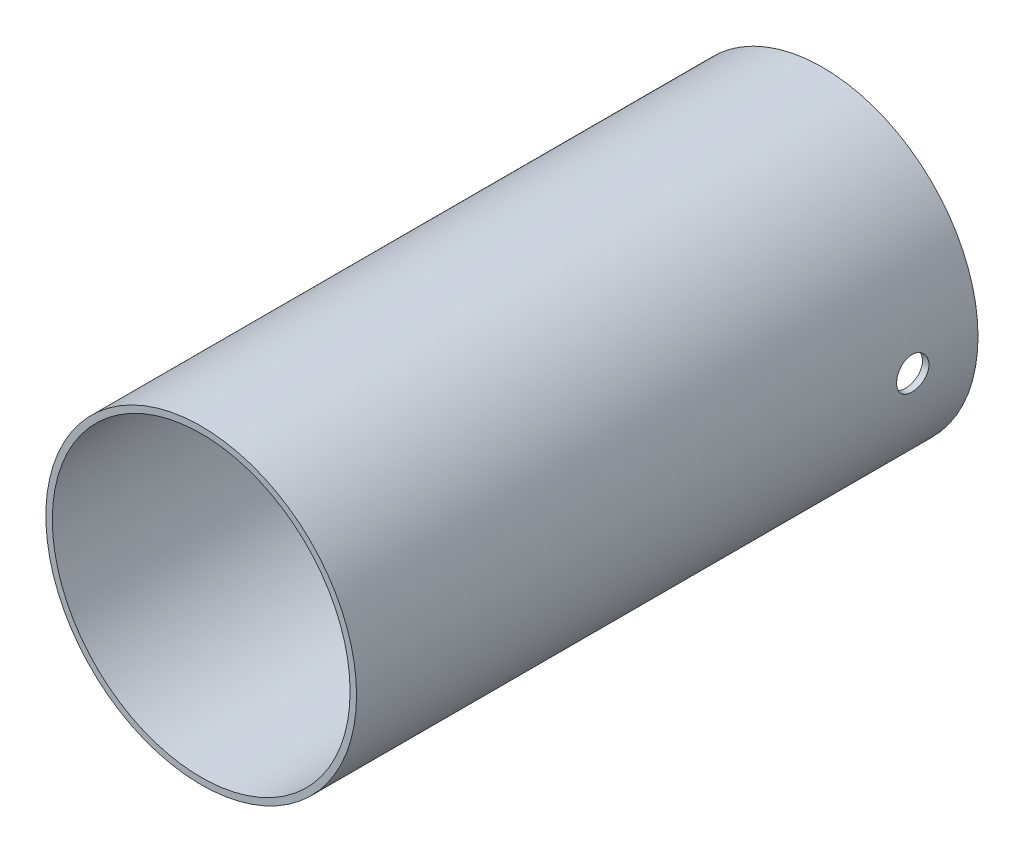
ISO-10303-21;
HEADER;
FILE_DESCRIPTION(('STEP AP214'),'2;1');
FILE_NAME('part.step','',(''),(''),'','','');
FILE_SCHEMA(('AUTOMOTIVE_DESIGN { 1 0 10303 214 1 1 1 1 }'));
ENDSEC;
DATA;
#1=APPLICATION_CONTEXT('core data for automotive mechanical design processes');
#2=APPLICATION_PROTOCOL_DEFINITION('international standard','automotive_design',2000,#1);
#3=PRODUCT_CONTEXT('',#1,'mechanical');
#4=PRODUCT('Part','Part','',(#3));
#5=PRODUCT_RELATED_PRODUCT_CATEGORY('part','',(#4));
#6=PRODUCT_DEFINITION_FORMATION('','',#4);
#7=PRODUCT_DEFINITION_CONTEXT('part definition',#1,'design');
#8=PRODUCT_DEFINITION('design','',#6,#7);
#9=PRODUCT_DEFINITION_SHAPE('','',#8);
#10=(LENGTH_UNIT() NAMED_UNIT(*) SI_UNIT(.MILLI.,.METRE.));
#11=(NAMED_UNIT(*) PLANE_ANGLE_UNIT() SI_UNIT($,.RADIAN.));
#12=(NAMED_UNIT(*) SI_UNIT($,.STERADIAN.) SOLID_ANGLE_UNIT());
#13=UNCERTAINTY_MEASURE_WITH_UNIT(LENGTH_MEASURE(1.E-05),#10,'distance_accuracy_value','');
#14=(GEOMETRIC_REPRESENTATION_CONTEXT(3) GLOBAL_UNCERTAINTY_ASSIGNED_CONTEXT((#13)) GLOBAL_UNIT_ASSIGNED_CONTEXT((#10,
#11,#12)) REPRESENTATION_CONTEXT('',''));
#15=CARTESIAN_POINT('',(0.,0.,0.));
#16=DIRECTION('',(0.,0.,1.));
#17=DIRECTION('',(1.,0.,0.));
#18=AXIS2_PLACEMENT_3D('',#15,#16,#17);
#19=CARTESIAN_POINT('',(0.,0.,152.4));
#20=DIRECTION('',(0.,0.,1.));
#21=DIRECTION('',(1.,0.,0.));
#22=AXIS2_PLACEMENT_3D('',#19,#20,#21);
#23=PLANE('',#22);
#24=CARTESIAN_POINT('',(0.,0.,152.4));
#25=DIRECTION('',(0.,0.,1.));
#26=DIRECTION('',(1.,0.,0.));
#27=AXIS2_PLACEMENT_3D('',#24,#25,#26);
#28=CIRCLE('',#27,38.1);
#29=CARTESIAN_POINT('',(38.1,0.,152.4));
#30=VERTEX_POINT('',#29);
#31=EDGE_CURVE('E10',#30,#30,#28,.T.);
#32=ORIENTED_EDGE('',*,*,#31,.T.);
#33=EDGE_LOOP('',(#32));
#34=FACE_BOUND('',#33,.T.);
#35=CARTESIAN_POINT('',(0.,0.,152.4));
#36=DIRECTION('',(0.,0.,1.));
#37=DIRECTION('',(1.,0.,0.));
#38=AXIS2_PLACEMENT_3D('',#35,#36,#37);
#39=CIRCLE('',#38,36.5125);
#40=CARTESIAN_POINT('',(36.5125,0.,152.4));
#41=VERTEX_POINT('',#40);
#42=EDGE_CURVE('E62',#41,#41,#39,.T.);
#43=ORIENTED_EDGE('',*,*,#42,.F.);
#44=EDGE_LOOP('',(#43));
#45=FACE_BOUND('',#44,.T.);
#46=ADVANCED_FACE('F43',(#34,#45),#23,.T.);
#47=CARTESIAN_POINT('',(0.,0.,0.));
#48=DIRECTION('',(0.,0.,1.));
#49=DIRECTION('',(1.,0.,0.));
#50=AXIS2_PLACEMENT_3D('',#47,#48,#49);
#51=PLANE('',#50);
#52=CARTESIAN_POINT('',(0.,0.,0.));
#53=DIRECTION('',(0.,0.,1.));
#54=DIRECTION('',(1.,0.,0.));
#55=AXIS2_PLACEMENT_3D('',#52,#53,#54);
#56=CIRCLE('',#55,38.1);
#57=CARTESIAN_POINT('',(38.1,0.,0.));
#58=VERTEX_POINT('',#57);
#59=EDGE_CURVE('E60',#58,#58,#56,.T.);
#60=ORIENTED_EDGE('',*,*,#59,.F.);
#61=EDGE_LOOP('',(#60));
#62=FACE_BOUND('',#61,.T.);
#63=CARTESIAN_POINT('',(0.,0.,0.));
#64=DIRECTION('',(0.,0.,1.));
#65=DIRECTION('',(1.,0.,0.));
#66=AXIS2_PLACEMENT_3D('',#63,#64,#65);
#67=CIRCLE('',#66,36.5125);
#68=CARTESIAN_POINT('',(36.5125,0.,0.));
#69=VERTEX_POINT('',#68);
#70=EDGE_CURVE('E65',#69,#69,#67,.T.);
#71=ORIENTED_EDGE('',*,*,#70,.T.);
#72=EDGE_LOOP('',(#71));
#73=FACE_BOUND('',#72,.T.);
#74=ADVANCED_FACE('F101',(#62,#73),#51,.F.);
#75=CARTESIAN_POINT('',(0.,0.,152.4));
#76=DIRECTION('',(0.,0.,-1.));
#77=DIRECTION('',(-1.,0.,0.));
#78=AXIS2_PLACEMENT_3D('',#75,#76,#77);
#79=CYLINDRICAL_SURFACE('',#78,38.1);
#80=CARTESIAN_POINT('',(-38.1,0.,19.9657647635163));
#81=CARTESIAN_POINT('',(-38.0999973380005,-0.222240286314071,19.9681301815195));
#82=CARTESIAN_POINT('',(-38.0980348164911,-0.444826119671895,19.9517851275532));
#83=CARTESIAN_POINT('',(-38.0903739183317,-0.884224198578029,19.8820706361082));
#84=CARTESIAN_POINT('',(-38.0846714682688,-1.10102988031823,19.8286608251671));
#85=CARTESIAN_POINT('',(-38.0701539071397,-1.52243577563149,19.6863898306075));
#86=CARTESIAN_POINT('',(-38.061340695723,-1.72704334928982,19.597550278587));
#87=CARTESIAN_POINT('',(-38.0415672665706,-2.11839546348186,19.3869870970999));
#88=CARTESIAN_POINT('',(-38.0306074657095,-2.30514346193822,19.2652698508485));
#89=CARTESIAN_POINT('',(-38.007703089001,-2.65624028697904,18.991905252133));
#90=CARTESIAN_POINT('',(-37.9957552682925,-2.82051019083909,18.8401567985776));
#91=CARTESIAN_POINT('',(-37.9722305156241,-3.12130232645465,18.5112441400305));
#92=CARTESIAN_POINT('',(-37.960653601519,-3.25782322411344,18.3340787137581));
#93=CARTESIAN_POINT('',(-37.9391338582952,-3.49956265491322,17.9588198449494));
#94=CARTESIAN_POINT('',(-37.9291951668749,-3.60470245451846,17.7606754250677));
#95=CARTESIAN_POINT('',(-37.9121084495107,-3.78019198118367,17.3494242630021));
#96=CARTESIAN_POINT('',(-37.9049603518898,-3.85054260182365,17.1363179052846));
#97=CARTESIAN_POINT('',(-37.8942860186173,-3.95421553052005,16.7019820706622));
#98=CARTESIAN_POINT('',(-37.8907471823665,-3.98766669500737,16.4807836665807));
#99=CARTESIAN_POINT('',(-37.8876494621099,-4.01699457768456,16.0358854458264));
#100=CARTESIAN_POINT('',(-37.888090461606,-4.0128723957251,15.8121857025645));
#101=CARTESIAN_POINT('',(-37.8928919590414,-3.96727193251874,15.3695936000412));
#102=CARTESIAN_POINT('',(-37.8972365405565,-3.92594534677651,15.1506854132345));
#103=CARTESIAN_POINT('',(-37.9093337386499,-3.80735295205664,14.7229312695853));
#104=CARTESIAN_POINT('',(-37.9170864004554,-3.73008666613593,14.5140854463174));
#105=CARTESIAN_POINT('',(-37.9351485611281,-3.54167042537473,14.1119623256837));
#106=CARTESIAN_POINT('',(-37.9454624893978,-3.43046169402249,13.9187127754795));
#107=CARTESIAN_POINT('',(-37.9674925918325,-3.17735571225536,13.5535684037795));
#108=CARTESIAN_POINT('',(-37.9792088108406,-3.03545748032039,13.3816742655552));
#109=CARTESIAN_POINT('',(-38.0028056567546,-2.7241846474097,13.0632501809492));
#110=CARTESIAN_POINT('',(-38.0146868039183,-2.55468090318136,12.9168464874082));
#111=CARTESIAN_POINT('',(-38.0372385448196,-2.19343985900176,12.6545505263645));
#112=CARTESIAN_POINT('',(-38.0479091352636,-2.00170249856308,12.5386583418724));
#113=CARTESIAN_POINT('',(-38.0668618378565,-1.60130175853183,12.3406546980226));
#114=CARTESIAN_POINT('',(-38.0751429821874,-1.392631564209,12.2585569209766));
#115=CARTESIAN_POINT('',(-38.088395419989,-0.964361874354098,12.13060136007));
#116=CARTESIAN_POINT('',(-38.0933668196799,-0.744762729809806,12.0847424131818));
#117=CARTESIAN_POINT('',(-38.0994438290943,-0.301949542599554,12.0307392475563));
#118=CARTESIAN_POINT('',(-38.1005671145875,-0.0787567727203302,12.0224225277416));
#119=CARTESIAN_POINT('',(-38.09889204431,0.365852386752666,12.0432781524268));
#120=CARTESIAN_POINT('',(-38.096093750969,0.587268804568697,12.0724499001272));
#121=CARTESIAN_POINT('',(-38.0869220713211,1.02148859161998,12.1673073993738));
#122=CARTESIAN_POINT('',(-38.0805573924802,1.23431159040156,12.2329042142271));
#123=CARTESIAN_POINT('',(-38.0649886621349,1.64593424221331,12.3986541166961));
#124=CARTESIAN_POINT('',(-38.0557845444878,1.8447335684398,12.4988080093));
#125=CARTESIAN_POINT('',(-38.0355424590914,2.22343009907675,12.7312344626035));
#126=CARTESIAN_POINT('',(-38.0244981988321,2.40325886231441,12.8636179771196));
#127=CARTESIAN_POINT('',(-38.0018481097387,2.73820659016409,13.1565956440352));
#128=CARTESIAN_POINT('',(-37.99024226516,2.89332486146299,13.3171905877095));
#129=CARTESIAN_POINT('',(-37.9677356696638,3.17508422481082,13.6628101230627));
#130=CARTESIAN_POINT('',(-37.95683795018,3.30160798182817,13.8479305990597));
#131=CARTESIAN_POINT('',(-37.9370452792416,3.52177009745061,14.2368897422551));
#132=CARTESIAN_POINT('',(-37.9281503011811,3.61540889293101,14.440728160741));
#133=CARTESIAN_POINT('',(-37.9133988897085,3.76696309764424,14.8609930660663));
#134=CARTESIAN_POINT('',(-37.9075373001905,3.82493915769373,15.0773974921879));
#135=CARTESIAN_POINT('',(-37.899506573112,3.90371527137365,15.5169350965197));
#136=CARTESIAN_POINT('',(-37.8973373186853,3.92451650162751,15.7400680615372));
#137=CARTESIAN_POINT('',(-37.8969431222345,3.92832072208022,16.1855785181006));
#138=CARTESIAN_POINT('',(-37.8986992014745,3.91150558468665,16.4079544608685));
#139=CARTESIAN_POINT('',(-37.9059147493473,3.84094588855145,16.8467038996259));
#140=CARTESIAN_POINT('',(-37.9113742164697,3.78720134486996,17.0630773980632));
#141=CARTESIAN_POINT('',(-37.9253693568586,3.64437481518619,17.4836259297361));
#142=CARTESIAN_POINT('',(-37.9339038737421,3.55530611168854,17.6878055149316));
#143=CARTESIAN_POINT('',(-37.9530799658502,3.34438111362365,18.0783453010408));
#144=CARTESIAN_POINT('',(-37.9637215343167,3.22252492421954,18.264705559106));
#145=CARTESIAN_POINT('',(-37.9859618408592,2.94882785356972,18.6152385768411));
#146=CARTESIAN_POINT('',(-37.9975647169562,2.79685295708304,18.7793064362522));
#147=CARTESIAN_POINT('',(-38.0203719713399,2.46748951150007,19.0796934274808));
#148=CARTESIAN_POINT('',(-38.031576253276,2.29009486920403,19.2160058872138));
#149=CARTESIAN_POINT('',(-38.0523415715049,1.91436093031876,19.4573347989211));
#150=CARTESIAN_POINT('',(-38.0618977662411,1.71596259699027,19.5622596857727));
#151=CARTESIAN_POINT('',(-38.078219614406,1.30438931487588,19.7371689258021));
#152=CARTESIAN_POINT('',(-38.0849883917652,1.09123122255266,19.8071924125017));
#153=CARTESIAN_POINT('',(-38.0932619855573,0.730741349430766,19.8927382891227));
#154=CARTESIAN_POINT('',(-38.0957753500471,0.58582585548763,19.9187095843001));
#155=CARTESIAN_POINT('',(-38.0991452343958,0.293990677338522,19.9544401091937));
#156=CARTESIAN_POINT('',(-38.10000176162,0.147071002044943,19.9641994109794));
#157=CARTESIAN_POINT('',(-38.1,0.,19.9657647635163));
#158=B_SPLINE_CURVE_WITH_KNOTS('',3,(#80,#81,#82,#83,#84,#85,#86,#87,#88,#89,#90,#91,#92,#93,
#94,#95,#96,#97,#98,#99,#100,#101,#102,#103,#104,#105,#106,#107,#108,#109,#110,#111,#112,#113,
#114,#115,#116,#117,#118,#119,#120,#121,#122,#123,#124,#125,#126,#127,#128,#129,#130,#131,#132,
#133,#134,#135,#136,#137,#138,#139,#140,#141,#142,#143,#144,#145,#146,#147,#148,#149,#150,#151,
#152,#153,#154,#155,#156,#157),.UNSPECIFIED.,.T.,.F.,(4,2,2,2,2,2,2,2,2,2,2,2,2,2,2,2,2,2,2,2,2,
2,2,2,2,2,2,2,2,2,2,2,2,2,2,2,2,2,4),(0.,0.66622162994521,1.33317009535484,1.99971197783714,
2.6661245438917,3.33481999205229,4.00354758167027,4.6739391363386,5.34431347072074,
6.01233930903843,6.68034559290123,7.34564045385931,8.0109441439625,8.67740650868059,
9.34389019153536,10.0135864224992,10.6832844754403,11.3532534023813,12.0232008268593,
12.6900667859489,13.3569221289653,14.0221563693538,14.6874061070552,15.3549792506588,
16.0225711213576,16.6928545716466,17.3631291169119,18.0322605666568,18.701370837295,
19.367253003875,20.0331348989026,20.6987666476724,21.3643962615094,22.0330569709471,
22.7018782295895,23.3726319890328,24.0426319580571,24.4835165514881,24.9243991849886),.UNSPECIFIED.);
#159=CARTESIAN_POINT('',(-38.1,0.,19.9657647635163));
#160=VERTEX_POINT('',#159);
#161=EDGE_CURVE('E89',#160,#160,#158,.T.);
#162=ORIENTED_EDGE('',*,*,#161,.T.);
#163=EDGE_LOOP('',(#162));
#164=FACE_BOUND('',#163,.T.);
#165=CARTESIAN_POINT('',(37.8971247592395,-3.92656783751875,15.9972413707971));
#166=CARTESIAN_POINT('',(37.8971274557515,-3.92655823071737,16.2195180016725));
#167=CARTESIAN_POINT('',(37.8990807778637,-3.90782926532647,16.4419403874323));
#168=CARTESIAN_POINT('',(37.9066799294298,-3.83340083515749,16.8806148964558));
#169=CARTESIAN_POINT('',(37.9123297961887,-3.77766094667101,17.0968600031776));
#170=CARTESIAN_POINT('',(37.9266700087259,-3.6308550065597,17.5167639738677));
#171=CARTESIAN_POINT('',(37.9353584776029,-3.53981075816766,17.7204305162731));
#172=CARTESIAN_POINT('',(37.954786099503,-3.32502398812938,18.1095504227851));
#173=CARTESIAN_POINT('',(37.9655248537506,-3.20128782318803,18.2950073180196));
#174=CARTESIAN_POINT('',(37.9878787831124,-2.92410814897545,18.6432159425045));
#175=CARTESIAN_POINT('',(37.9994968942879,-2.77056217479886,18.8058859276921));
#176=CARTESIAN_POINT('',(38.0222586653219,-2.4383419009891,19.1031988710632));
#177=CARTESIAN_POINT('',(38.033402303174,-2.25966643748756,19.2378405304023));
#178=CARTESIAN_POINT('',(38.0539725461321,-1.88175704679417,19.4755592889126));
#179=CARTESIAN_POINT('',(38.0633951801345,-1.68247719367238,19.5785637511829));
#180=CARTESIAN_POINT('',(38.0794101472821,-1.26933528067318,19.7496194269149));
#181=CARTESIAN_POINT('',(38.0860025548489,-1.05547360440007,19.8176715594667));
#182=CARTESIAN_POINT('',(38.0955737183549,-0.620067305100164,19.9166502804125));
#183=CARTESIAN_POINT('',(38.0985655727999,-0.398553564939551,19.9477114345117));
#184=CARTESIAN_POINT('',(38.1006214368524,0.0465605694395146,19.9722429586582));
#185=CARTESIAN_POINT('',(38.0996855562951,0.270160905133927,19.9657143798631));
#186=CARTESIAN_POINT('',(38.0939821109215,0.712187307715731,19.9153607843175));
#187=CARTESIAN_POINT('',(38.0892294161831,0.930630074789205,19.8716804695403));
#188=CARTESIAN_POINT('',(38.0764220182467,1.35706343083521,19.7484888695129));
#189=CARTESIAN_POINT('',(38.0683672690476,1.56505387415059,19.6689770850911));
#190=CARTESIAN_POINT('',(38.0498156656909,1.9651340857752,19.4762216609764));
#191=CARTESIAN_POINT('',(38.0393141995361,2.15719288451326,19.3629142028886));
#192=CARTESIAN_POINT('',(38.0170294632349,2.51962106034087,19.1058301651));
#193=CARTESIAN_POINT('',(38.0052461522825,2.68998974657702,18.9620526152824));
#194=CARTESIAN_POINT('',(37.9816377006684,3.00505050094374,18.6472964065389));
#195=CARTESIAN_POINT('',(37.9698126270473,3.14961681149344,18.4761918339352));
#196=CARTESIAN_POINT('',(37.9474957628723,3.40799608306273,18.1120745546881));
#197=CARTESIAN_POINT('',(37.9370039745325,3.52180899301081,17.9190618116631));
#198=CARTESIAN_POINT('',(37.9185300973954,3.71545227670994,17.5165081419144));
#199=CARTESIAN_POINT('',(37.9105486081148,3.79527453432796,17.3069632818683));
#200=CARTESIAN_POINT('',(37.8980036882771,3.91857008465702,16.877342920876));
#201=CARTESIAN_POINT('',(37.8934401445216,3.96204458116975,16.6572677689379));
#202=CARTESIAN_POINT('',(37.8882634358607,4.01124848756343,16.2139389736786));
#203=CARTESIAN_POINT('',(37.8876318436474,4.01715396955978,15.9907050788287));
#204=CARTESIAN_POINT('',(37.8903413503375,3.9915150026141,15.5464258174389));
#205=CARTESIAN_POINT('',(37.893682390907,3.95997110357769,15.3253804188112));
#206=CARTESIAN_POINT('',(37.9039469143106,3.86047593329806,14.892268278772));
#207=CARTESIAN_POINT('',(37.9108621739626,3.79260821934209,14.6801821312818));
#208=CARTESIAN_POINT('',(37.9274956380685,3.62247670500552,14.2704050339183));
#209=CARTESIAN_POINT('',(37.9372139120039,3.52021205197863,14.0727144410359));
#210=CARTESIAN_POINT('',(37.9584125496614,3.28374883786635,13.6965384241509));
#211=CARTESIAN_POINT('',(37.9698992861616,3.14943377792062,13.5181265955716));
#212=CARTESIAN_POINT('',(37.9933326969598,2.85284801400423,13.1863195689913));
#213=CARTESIAN_POINT('',(38.0052793836138,2.69057655860184,13.0329250436389));
#214=CARTESIAN_POINT('',(38.028357865765,2.34191851209759,12.754897959888));
#215=CARTESIAN_POINT('',(38.0394862863892,2.15543996058321,12.6303804040065));
#216=CARTESIAN_POINT('',(38.0596405345334,1.76411321691325,12.414433882795));
#217=CARTESIAN_POINT('',(38.068666392981,1.55926529502298,12.3230044307451));
#218=CARTESIAN_POINT('',(38.0836016623381,1.13741235377192,12.1760235777196));
#219=CARTESIAN_POINT('',(38.0895170630379,0.920431597064805,12.1204031727567));
#220=CARTESIAN_POINT('',(38.0976103687997,0.480144601825986,12.0463941717553));
#221=CARTESIAN_POINT('',(38.099788388474,0.256838557481963,12.0280044339809));
#222=CARTESIAN_POINT('',(38.1001810925162,-0.188631797274189,12.0289956261599));
#223=CARTESIAN_POINT('',(38.0984144852633,-0.410796509489365,12.0481982118579));
#224=CARTESIAN_POINT('',(38.0911753167315,-0.848729514816825,12.1234544153155));
#225=CARTESIAN_POINT('',(38.0857027532447,-1.06449780411844,12.1795080550288));
#226=CARTESIAN_POINT('',(38.0716847253684,-1.48350777297389,12.3268247575641));
#227=CARTESIAN_POINT('',(38.0631397617795,-1.68675148771085,12.4180820823671));
#228=CARTESIAN_POINT('',(38.0439473937904,-2.07506784830623,12.6331968483577));
#229=CARTESIAN_POINT('',(38.0332999959452,-2.26014055081702,12.7570541879026));
#230=CARTESIAN_POINT('',(38.0110515859671,-2.60777415761084,13.0345208596325));
#231=CARTESIAN_POINT('',(37.9994464540059,-2.77022876471989,13.188263043028));
#232=CARTESIAN_POINT('',(37.9766384065978,-3.06711046549517,13.5208700193721));
#233=CARTESIAN_POINT('',(37.9654355881205,-3.20153083910927,13.6997408187129));
#234=CARTESIAN_POINT('',(37.9446804058354,-3.43882232509605,14.0780682752151));
#235=CARTESIAN_POINT('',(37.9351326408927,-3.54160612452733,14.2775799089822));
#236=CARTESIAN_POINT('',(37.9188333452581,-3.71207183965686,14.6910044891151));
#237=CARTESIAN_POINT('',(37.9120786792984,-3.77979313484693,14.9049009729975));
#238=CARTESIAN_POINT('',(37.9038309097553,-3.86142444492814,15.2662015532638));
#239=CARTESIAN_POINT('',(37.9013281822119,-3.88581956237082,15.4113000573816));
#240=CARTESIAN_POINT('',(37.8979742192074,-3.91839439735856,15.7033249236308));
#241=CARTESIAN_POINT('',(37.8971229760536,-3.92657419043416,15.8502512772447));
#242=CARTESIAN_POINT('',(37.8971247592395,-3.92656783751875,15.9972413707971));
#243=B_SPLINE_CURVE_WITH_KNOTS('',3,(#165,#166,#167,#168,#169,#170,#171,#172,#173,#174,#175,
#176,#177,#178,#179,#180,#181,#182,#183,#184,#185,#186,#187,#188,#189,#190,#191,#192,#193,#194,
#195,#196,#197,#198,#199,#200,#201,#202,#203,#204,#205,#206,#207,#208,#209,#210,#211,#212,#213,
#214,#215,#216,#217,#218,#219,#220,#221,#222,#223,#224,#225,#226,#227,#228,#229,#230,#231,#232,
#233,#234,#235,#236,#237,#238,#239,#240,#241,#242),.UNSPECIFIED.,.T.,.F.,(4,2,2,2,2,2,2,2,2,2,2,
2,2,2,2,2,2,2,2,2,2,2,2,2,2,2,2,2,2,2,2,2,2,2,2,2,2,2,4),(0.,0.666293082328565,1.33331509646209,
1.99992582616855,2.66640703354772,3.33522103996187,4.00406603259939,4.67443536373224,
5.34478706624591,6.01269264217841,6.68057954091888,7.34587694287392,8.01118361343493,
8.67775466335343,9.34434693896766,10.0141042995011,10.6838627722798,11.3537810773826,
12.0236771945784,12.690431428501,13.3571758719453,14.0223931242983,14.6876268675617,
15.3553165007694,16.0230240834112,16.6933468176528,17.3636596911712,18.0326769755783,
18.7016737432253,19.3675043691274,20.03333539169,20.6990579330537,21.3647783988056,
22.0335289113435,22.7024395454715,23.3731800690686,24.0431656256742,24.4837829695538,
24.9243982610446),.UNSPECIFIED.);
#244=CARTESIAN_POINT('',(37.8971247592395,-3.92656783751875,15.9972413707971));
#245=VERTEX_POINT('',#244);
#246=EDGE_CURVE('E82',#245,#245,#243,.T.);
#247=ORIENTED_EDGE('',*,*,#246,.T.);
#248=EDGE_LOOP('',(#247));
#249=FACE_BOUND('',#248,.T.);
#250=ORIENTED_EDGE('',*,*,#31,.F.);
#251=EDGE_LOOP('',(#250));
#252=FACE_BOUND('',#251,.T.);
#253=ORIENTED_EDGE('',*,*,#59,.T.);
#254=EDGE_LOOP('',(#253));
#255=FACE_BOUND('',#254,.T.);
#256=ADVANCED_FACE('F44',(#164,#249,#252,#255),#79,.T.);
#257=CARTESIAN_POINT('',(0.,0.,152.4));
#258=DIRECTION('',(0.,0.,-1.));
#259=DIRECTION('',(-1.,0.,0.));
#260=AXIS2_PLACEMENT_3D('',#257,#258,#259);
#261=CYLINDRICAL_SURFACE('',#260,36.5125);
#262=CARTESIAN_POINT('',(-36.5125,0.,19.9657832545258));
#263=CARTESIAN_POINT('',(-36.5124972375524,-0.222182994354342,19.9680491485892));
#264=CARTESIAN_POINT('',(-36.5104504546767,-0.444701681407492,19.9516141540668));
#265=CARTESIAN_POINT('',(-36.502461548977,-0.883946517142479,19.8817437653123));
#266=CARTESIAN_POINT('',(-36.4965152176834,-1.10066614406545,19.8282683928639));
#267=CARTESIAN_POINT('',(-36.481377716997,-1.52188372605675,19.6858971378513));
#268=CARTESIAN_POINT('',(-36.4721885659854,-1.72638919104295,19.5970232834342));
#269=CARTESIAN_POINT('',(-36.4515721640367,-2.11753406145924,19.3864251797933));
#270=CARTESIAN_POINT('',(-36.4401453370795,-2.30417684143469,19.2647071520171));
#271=CARTESIAN_POINT('',(-36.4162612021831,-2.65512270559054,18.9913325904491));
#272=CARTESIAN_POINT('',(-36.4038002200761,-2.81934013068694,18.8395664033502));
#273=CARTESIAN_POINT('',(-36.3792644983985,-3.12002980572399,18.5106286327173));
#274=CARTESIAN_POINT('',(-36.3671897777442,-3.25650069858262,18.3334558072678));
#275=CARTESIAN_POINT('',(-36.3447419178399,-3.49817283167958,17.9581444111416));
#276=CARTESIAN_POINT('',(-36.3343734753132,-3.60328838760044,17.7599503611561));
#277=CARTESIAN_POINT('',(-36.3165494412497,-3.77871841483195,17.3485937163481));
#278=CARTESIAN_POINT('',(-36.309093768485,-3.84903385662007,17.1354315391338));
#279=CARTESIAN_POINT('',(-36.2979655169783,-3.9526048653127,16.7010506030112));
#280=CARTESIAN_POINT('',(-36.294278604159,-3.98600089110474,16.4798657085813));
#281=CARTESIAN_POINT('',(-36.2910574807767,-4.01522467358259,16.0350014084211));
#282=CARTESIAN_POINT('',(-36.2915231385813,-4.01105362110755,15.8113220819864));
#283=CARTESIAN_POINT('',(-36.2965423792604,-3.96537224088151,15.36886228549));
#284=CARTESIAN_POINT('',(-36.301077885313,-3.92402702595596,15.1500645330176));
#285=CARTESIAN_POINT('',(-36.3137003990839,-3.80543607203999,14.7225342795033));
#286=CARTESIAN_POINT('',(-36.3217874578873,-3.72818981665295,14.5138019232885));
#287=CARTESIAN_POINT('',(-36.340626351377,-3.5398390954268,14.1118671822922));
#288=CARTESIAN_POINT('',(-36.3513832231271,-3.42867053727692,13.9186950777105));
#289=CARTESIAN_POINT('',(-36.3743568817646,-3.17567282405513,13.5536924970126));
#290=CARTESIAN_POINT('',(-36.3865737194785,-3.03384260140352,13.3818627643245));
#291=CARTESIAN_POINT('',(-36.4111824855036,-2.72265951086296,13.0634753350866));
#292=CARTESIAN_POINT('',(-36.4235749963262,-2.5531660514556,12.9170550598833));
#293=CARTESIAN_POINT('',(-36.4470955049521,-2.19193728947067,12.6547222499444));
#294=CARTESIAN_POINT('',(-36.4582234990007,-2.00020192085391,12.5388098057939));
#295=CARTESIAN_POINT('',(-36.4779864293842,-1.5997850579379,12.3407608247041));
#296=CARTESIAN_POINT('',(-36.4866202683242,-1.39109615589247,12.2586391485265));
#297=CARTESIAN_POINT('',(-36.500432773758,-0.962775812123321,12.130642949427));
#298=CARTESIAN_POINT('',(-36.5056115610828,-0.743144753360329,12.0847671588942));
#299=CARTESIAN_POINT('',(-36.5119325118499,-0.300351244157475,12.0307533462751));
#300=CARTESIAN_POINT('',(-36.5130947546177,-0.0772119783675867,12.0224275420388));
#301=CARTESIAN_POINT('',(-36.5113290956137,0.367291867084313,12.043247359859));
#302=CARTESIAN_POINT('',(-36.508401264607,0.58865647738416,12.0723923336083));
#303=CARTESIAN_POINT('',(-36.4988180205763,1.0227272204585,12.1671665475943));
#304=CARTESIAN_POINT('',(-36.4921724903912,1.23545471203719,12.2326990546484));
#305=CARTESIAN_POINT('',(-36.4759209562523,1.64689914788561,12.3982840257744));
#306=CARTESIAN_POINT('',(-36.4663148774926,1.84561573797805,12.4983373621113));
#307=CARTESIAN_POINT('',(-36.4451862325266,2.22422845844602,12.730564138115));
#308=CARTESIAN_POINT('',(-36.4336565264817,2.40405024684412,12.862858119625));
#309=CARTESIAN_POINT('',(-36.410008999707,2.73900504531942,13.1556477222275));
#310=CARTESIAN_POINT('',(-36.3978911610154,2.89413730074686,13.3161442050303));
#311=CARTESIAN_POINT('',(-36.374383980731,3.17600244889429,13.6616296852827));
#312=CARTESIAN_POINT('',(-36.3629980732112,3.30260759190418,13.8467231790753));
#313=CARTESIAN_POINT('',(-36.3423152898156,3.52293515849923,14.2356517023262));
#314=CARTESIAN_POINT('',(-36.3330183839986,3.61665805338898,14.4394864631112));
#315=CARTESIAN_POINT('',(-36.3175979570582,3.76836531401338,14.8597388871178));
#316=CARTESIAN_POINT('',(-36.3114686011055,3.82641542888075,15.0761325918227));
#317=CARTESIAN_POINT('',(-36.3030658072431,3.90533843121432,15.5156675090786));
#318=CARTESIAN_POINT('',(-36.3007922355361,3.92621260870285,15.7388084872229));
#319=CARTESIAN_POINT('',(-36.3003654348348,3.93015614186484,16.184250414038));
#320=CARTESIAN_POINT('',(-36.3021906100851,3.91342364176364,16.4065496127638));
#321=CARTESIAN_POINT('',(-36.3097068640378,3.84305560379208,16.8451584267417));
#322=CARTESIAN_POINT('',(-36.3153979403198,3.7894200890268,17.0614680457438));
#323=CARTESIAN_POINT('',(-36.3299917309378,3.6468413738414,17.4818966083534));
#324=CARTESIAN_POINT('',(-36.3388931002117,3.55791295902512,17.6860206158544));
#325=CARTESIAN_POINT('',(-36.3588972054664,3.34729592617433,18.0764769190116));
#326=CARTESIAN_POINT('',(-36.3699999412401,3.22560731122177,18.2628092163414));
#327=CARTESIAN_POINT('',(-36.3932133279261,2.95220942878641,18.6133974004728));
#328=CARTESIAN_POINT('',(-36.4053287117457,2.80035403455966,18.7775390231413));
#329=CARTESIAN_POINT('',(-36.4291491011184,2.47121752426894,19.0780972457379));
#330=CARTESIAN_POINT('',(-36.4408540077037,2.29393032823261,19.2145071969605));
#331=CARTESIAN_POINT('',(-36.4625570558903,1.91834702068775,19.4560821722026));
#332=CARTESIAN_POINT('',(-36.4725497707762,1.71998722506065,19.5611486065665));
#333=CARTESIAN_POINT('',(-36.4896264909626,1.30845471067828,19.7363431857006));
#334=CARTESIAN_POINT('',(-36.4967137319773,1.09529878097426,19.8065102152701));
#335=CARTESIAN_POINT('',(-36.5054031578681,0.734148622699175,19.8924383478986));
#336=CARTESIAN_POINT('',(-36.5080503339897,0.588564178216205,19.9185796967184));
#337=CARTESIAN_POINT('',(-36.5115996692742,0.295369304488053,19.9544986628738));
#338=CARTESIAN_POINT('',(-36.5125018371171,0.14775888532423,19.9642763616061));
#339=CARTESIAN_POINT('',(-36.5125,0.,19.9657832545258));
#340=B_SPLINE_CURVE_WITH_KNOTS('',3,(#262,#263,#264,#265,#266,#267,#268,#269,#270,#271,#272,
#273,#274,#275,#276,#277,#278,#279,#280,#281,#282,#283,#284,#285,#286,#287,#288,#289,#290,#291,
#292,#293,#294,#295,#296,#297,#298,#299,#300,#301,#302,#303,#304,#305,#306,#307,#308,#309,#310,
#311,#312,#313,#314,#315,#316,#317,#318,#319,#320,#321,#322,#323,#324,#325,#326,#327,#328,#329,
#330,#331,#332,#333,#334,#335,#336,#337,#338,#339),.UNSPECIFIED.,.T.,.F.,(4,2,2,2,2,2,2,2,2,2,2,
2,2,2,2,2,2,2,2,2,2,2,2,2,2,2,2,2,2,2,2,2,2,2,2,2,2,2,4),(0.,0.666044121913969,1.33280823733567,
1.99915807827242,2.66538178560338,3.33408307519178,4.00281706307533,4.67336209376758,
5.34388842378793,6.01185488104997,6.67980016451195,7.34479327741002,8.00979595579235,
8.67606294306017,9.34235313218958,10.0121415195248,10.6819318956016,11.3520165231705,
12.0220777151329,12.6887842836485,13.3554793171791,14.0204104255828,14.6853583365552,
15.3528315700079,16.0203252012469,16.6907510758899,17.3611673408586,18.0303442142906,
18.6994978665211,19.3651341134774,20.0307699436772,20.696127206345,21.3614844064187,
22.0301468133605,22.6989693444415,23.3698739675726,24.0400293870447,24.4829724973168,
24.9259134042784),.UNSPECIFIED.);
#341=CARTESIAN_POINT('',(-36.5125,0.,19.9657832545258));
#342=VERTEX_POINT('',#341);
#343=EDGE_CURVE('E48',#342,#342,#340,.T.);
#344=ORIENTED_EDGE('',*,*,#343,.F.);
#345=EDGE_LOOP('',(#344));
#346=FACE_BOUND('',#345,.T.);
#347=CARTESIAN_POINT('',(36.3005614500533,-3.92834502824082,15.9972413707971));
#348=CARTESIAN_POINT('',(36.3005642543356,-3.92833545268796,16.2194601749053));
#349=CARTESIAN_POINT('',(36.3026033701105,-3.90961608704681,16.4418233192166));
#350=CARTESIAN_POINT('',(36.310536032819,-3.83522806451268,16.8803770001054));
#351=CARTESIAN_POINT('',(36.3164337563766,-3.77951936875365,17.096560582875));
#352=CARTESIAN_POINT('',(36.3314026113173,-3.63280119453228,17.5163411685704));
#353=CARTESIAN_POINT('',(36.3404717443331,-3.5418139418631,17.7199460027706));
#354=CARTESIAN_POINT('',(36.3607506000611,-3.32716667089114,18.1089545831663));
#355=CARTESIAN_POINT('',(36.3719599167032,-3.20351284891027,18.294361772024));
#356=CARTESIAN_POINT('',(36.395298152873,-2.92647719063948,18.642545480993));
#357=CARTESIAN_POINT('',(36.4074304070837,-2.77298410256907,18.8052332680868));
#358=CARTESIAN_POINT('',(36.4312020977738,-2.4408666679613,19.1025951557979));
#359=CARTESIAN_POINT('',(36.4428415110624,-2.26224114051496,19.2372679393246));
#360=CARTESIAN_POINT('',(36.4643333465904,-1.88438148793784,19.4750880120384));
#361=CARTESIAN_POINT('',(36.4741812548644,-1.68509723835144,19.5781561040155));
#362=CARTESIAN_POINT('',(36.4909244004495,-1.2719252035173,19.7493342342052));
#363=CARTESIAN_POINT('',(36.4978197218312,-1.05803783427289,19.8174452677793));
#364=CARTESIAN_POINT('',(36.5078374055373,-0.622632669287064,19.9165137865672));
#365=CARTESIAN_POINT('',(36.5109746400901,-0.401148543059815,19.9476177201044));
#366=CARTESIAN_POINT('',(36.5131515765295,0.0439157056286175,19.9722424864697));
#367=CARTESIAN_POINT('',(36.5121914024348,0.267495764446632,19.9657644568104));
#368=CARTESIAN_POINT('',(36.5062739329432,0.709410464451385,19.9155275713782));
#369=CARTESIAN_POINT('',(36.5013335270208,0.927763263489968,19.8719261982202));
#370=CARTESIAN_POINT('',(36.4880084757762,1.35402967310994,19.7489259179331));
#371=CARTESIAN_POINT('',(36.4796237788431,1.56194312721043,19.6695264743857));
#372=CARTESIAN_POINT('',(36.4603034989833,1.96192322438066,19.4770129247359));
#373=CARTESIAN_POINT('',(36.4493626911074,2.15395630284591,19.3638296276699));
#374=CARTESIAN_POINT('',(36.4261392035884,2.51635938460009,19.1070114947064));
#375=CARTESIAN_POINT('',(36.4138564774157,2.68672863627822,18.963375602739));
#376=CARTESIAN_POINT('',(36.3892356163937,3.00189227149057,18.648845054034));
#377=CARTESIAN_POINT('',(36.3768975233611,3.14654988845192,18.4778133174597));
#378=CARTESIAN_POINT('',(36.3536062639599,3.40512500328018,18.1138198914212));
#379=CARTESIAN_POINT('',(36.3426531002474,3.51904244219231,17.9208581598998));
#380=CARTESIAN_POINT('',(36.3233605393221,3.7129065870107,17.5183717136989));
#381=CARTESIAN_POINT('',(36.315021854385,3.79284403768157,17.3088425048912));
#382=CARTESIAN_POINT('',(36.3019092523998,3.91636744690082,16.8792244674279));
#383=CARTESIAN_POINT('',(36.2971352065363,3.95995471904075,16.659136020657));
#384=CARTESIAN_POINT('',(36.2917110046398,4.00936335900179,16.2158500086205));
#385=CARTESIAN_POINT('',(36.2910399183759,4.01537640588958,15.9926740540134));
#386=CARTESIAN_POINT('',(36.2938417860796,3.98997012290896,15.5484927061918));
#387=CARTESIAN_POINT('',(36.2973146736798,3.95855139252654,15.3274872782724));
#388=CARTESIAN_POINT('',(36.3079970903522,3.85933379540241,14.8944843551228));
#389=CARTESIAN_POINT('',(36.3151972365331,3.79162626595815,14.6824656801269));
#390=CARTESIAN_POINT('',(36.3325216265165,3.62184586631488,14.2727949790129));
#391=CARTESIAN_POINT('',(36.3426459489996,3.5197720714115,14.0751433396473));
#392=CARTESIAN_POINT('',(36.364738039339,3.28367840410345,13.698945609089));
#393=CARTESIAN_POINT('',(36.3767130443859,3.14953193195504,13.5204794006922));
#394=CARTESIAN_POINT('',(36.4011467045441,2.85328035858048,13.188530211561));
#395=CARTESIAN_POINT('',(36.4136053738128,2.69117443846777,13.0350479628221));
#396=CARTESIAN_POINT('',(36.4376816353794,2.34277094834938,12.7567584205832));
#397=CARTESIAN_POINT('',(36.4492954055364,2.15637294938217,12.6320764810067));
#398=CARTESIAN_POINT('',(36.4703325067771,1.76516885810926,12.4157909482419));
#399=CARTESIAN_POINT('',(36.4797558725521,1.56036305741567,12.3241868311578));
#400=CARTESIAN_POINT('',(36.4953514886614,1.13858691812003,12.1768679132722));
#401=CARTESIAN_POINT('',(36.5015304966173,0.921642914038853,12.121078460239));
#402=CARTESIAN_POINT('',(36.5099899039849,0.48139443280689,12.0467291277154));
#403=CARTESIAN_POINT('',(36.5122704342782,0.258090169441881,12.0281679983731));
#404=CARTESIAN_POINT('',(36.5126952735333,-0.187311372371091,12.0288216166011));
#405=CARTESIAN_POINT('',(36.5108608361383,-0.40940894085624,12.04784219565));
#406=CARTESIAN_POINT('',(36.5033259040451,-0.847237259050936,12.122710826886));
#407=CARTESIAN_POINT('',(36.4976254079315,-1.0629680064294,12.1785588925567));
#408=CARTESIAN_POINT('',(36.4830167140064,-1.48192893767381,12.3254409782521));
#409=CARTESIAN_POINT('',(36.4741091435871,-1.68516155742032,12.4164681165348));
#410=CARTESIAN_POINT('',(36.4540959947474,-2.07349782104137,12.6311040781052));
#411=CARTESIAN_POINT('',(36.4429904164187,-2.25860146567277,12.7547129000326));
#412=CARTESIAN_POINT('',(36.4197723873055,-2.60641887219756,13.0317290049077));
#413=CARTESIAN_POINT('',(36.4076552182183,-2.76901709584875,13.1852809653682));
#414=CARTESIAN_POINT('',(36.3838321109137,-3.0662204697376,13.5175322834251));
#415=CARTESIAN_POINT('',(36.3721262716088,-3.20081892465104,13.6962376386301));
#416=CARTESIAN_POINT('',(36.3504268440476,-3.43852545119329,14.074312591874));
#417=CARTESIAN_POINT('',(36.3404384206007,-3.54153924101379,14.2737417241194));
#418=CARTESIAN_POINT('',(36.3233760400622,-3.71247294970892,14.6870532452221));
#419=CARTESIAN_POINT('',(36.3162988352267,-3.78043199713775,14.900919216509));
#420=CARTESIAN_POINT('',(36.3076303517201,-3.86259648950311,15.2628434999672));
#421=CARTESIAN_POINT('',(36.3049923555071,-3.88721792561617,15.4085972310117));
#422=CARTESIAN_POINT('',(36.3014569774256,-3.92009533407962,15.7019598574043));
#423=CARTESIAN_POINT('',(36.3005595865038,-3.92835139155043,15.8495687430993));
#424=CARTESIAN_POINT('',(36.3005614500533,-3.92834502824082,15.9972413707971));
#425=B_SPLINE_CURVE_WITH_KNOTS('',3,(#347,#348,#349,#350,#351,#352,#353,#354,#355,#356,#357,
#358,#359,#360,#361,#362,#363,#364,#365,#366,#367,#368,#369,#370,#371,#372,#373,#374,#375,#376,
#377,#378,#379,#380,#381,#382,#383,#384,#385,#386,#387,#388,#389,#390,#391,#392,#393,#394,#395,
#396,#397,#398,#399,#400,#401,#402,#403,#404,#405,#406,#407,#408,#409,#410,#411,#412,#413,#414,
#415,#416,#417,#418,#419,#420,#421,#422,#423,#424),.UNSPECIFIED.,.T.,.F.,(4,2,2,2,2,2,2,2,2,2,2,
2,2,2,2,2,2,2,2,2,2,2,2,2,2,2,2,2,2,2,2,2,2,2,2,2,2,2,4),(0.,0.666117076796394,1.33295636582894,
1.99937622124038,2.66566975819313,3.33449685126444,4.00335538130964,4.67387653840726,
5.34437860213638,6.01221836560988,6.68003791533968,7.34503851236088,8.01004907445544,
8.67643106606693,9.34283617101502,10.0126863641742,10.6825378419903,11.3525716526187,
12.0225812490908,12.6891700865471,13.3557482484401,14.0206564878663,14.6855826196264,
15.3531780387756,16.0207930140258,16.6912612308066,17.3617188280579,18.0307743438182,
18.6998073972633,19.3653928826358,20.0309786116963,20.6964342045048,21.3618897695308,
22.0306440871974,22.6995581345107,23.3704499086537,24.0405911953972,24.4832529724522,
24.9259124471068),.UNSPECIFIED.);
#426=CARTESIAN_POINT('',(36.3005614500533,-3.92834502824082,15.9972413707971));
#427=VERTEX_POINT('',#426);
#428=EDGE_CURVE('E66',#427,#427,#425,.T.);
#429=ORIENTED_EDGE('',*,*,#428,.F.);
#430=EDGE_LOOP('',(#429));
#431=FACE_BOUND('',#430,.T.);
#432=ORIENTED_EDGE('',*,*,#42,.T.);
#433=EDGE_LOOP('',(#432));
#434=FACE_BOUND('',#433,.T.);
#435=ORIENTED_EDGE('',*,*,#70,.F.);
#436=EDGE_LOOP('',(#435));
#437=FACE_BOUND('',#436,.T.);
#438=ADVANCED_FACE('F75',(#346,#431,#434,#437),#261,.F.);
#439=CARTESIAN_POINT('',(-38.0999763957415,-0.0424104225444161,15.9972413707971));
#440=DIRECTION('',(-0.999999380465656,-0.00111313444998459,0.));
#441=DIRECTION('',(0.00111313444998459,-0.999999380465656,0.));
#442=AXIS2_PLACEMENT_3D('',#439,#440,#441);
#443=CYLINDRICAL_SURFACE('',#442,3.96874999999999);
#444=ORIENTED_EDGE('',*,*,#428,.T.);
#445=EDGE_LOOP('',(#444));
#446=FACE_BOUND('',#445,.T.);
#447=ORIENTED_EDGE('',*,*,#246,.F.);
#448=EDGE_LOOP('',(#447));
#449=FACE_BOUND('',#448,.T.);
#450=ADVANCED_FACE('F79',(#446,#449),#443,.F.);
#451=ORIENTED_EDGE('',*,*,#343,.T.);
#452=EDGE_LOOP('',(#451));
#453=FACE_BOUND('',#452,.T.);
#454=ORIENTED_EDGE('',*,*,#161,.F.);
#455=EDGE_LOOP('',(#454));
#456=FACE_BOUND('',#455,.T.);
#457=ADVANCED_FACE('F73',(#453,#456),#443,.F.);
#458=CLOSED_SHELL('',(#46,#74,#256,#438,#450,#457));
#459=MANIFOLD_SOLID_BREP('B2',#458);
#460=ADVANCED_BREP_SHAPE_REPRESENTATION('',(#18,#459),#14);
#461=SHAPE_DEFINITION_REPRESENTATION(#9,#460);
ENDSEC;
END-ISO-10303-21;
